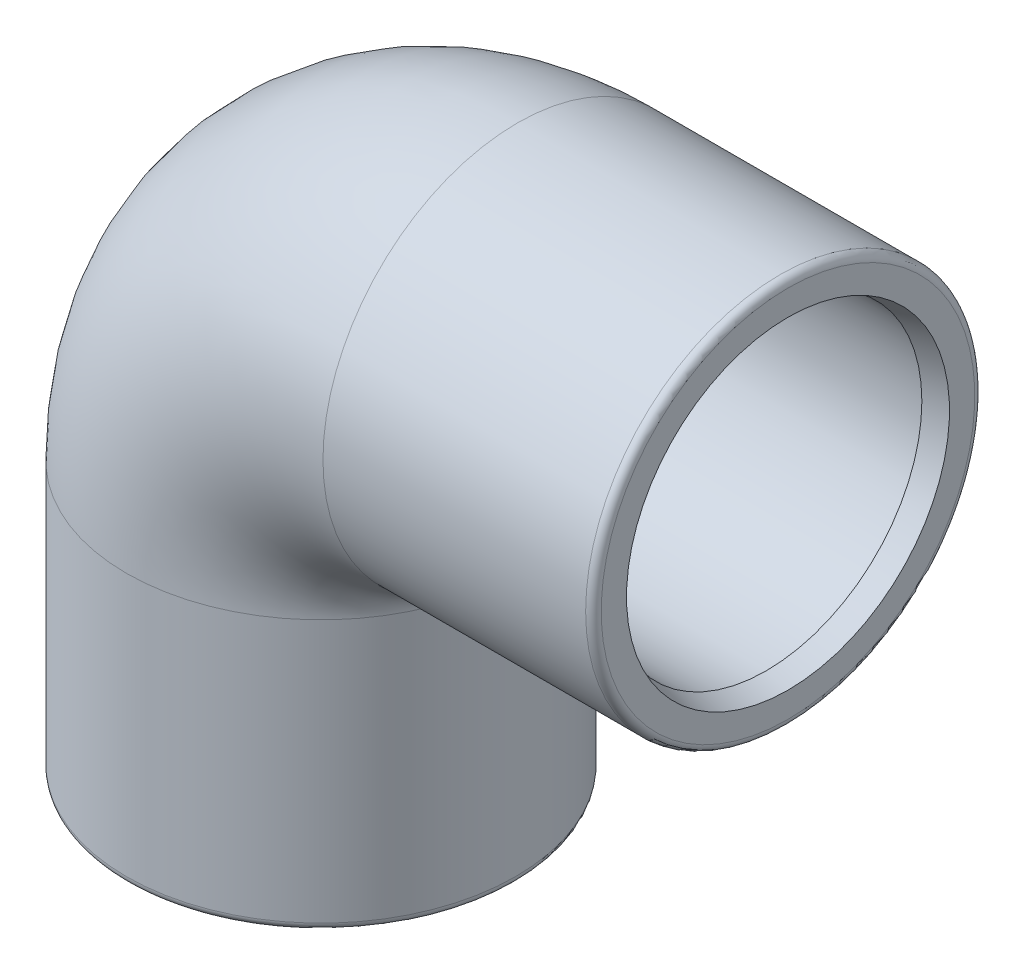
ISO-10303-21;
HEADER;
FILE_DESCRIPTION(('STEP AP214'),'2;1');
FILE_NAME('part.step','',(''),(''),'','','');
FILE_SCHEMA(('AUTOMOTIVE_DESIGN { 1 0 10303 214 1 1 1 1 }'));
ENDSEC;
DATA;
#1=APPLICATION_CONTEXT('core data for automotive mechanical design processes');
#2=APPLICATION_PROTOCOL_DEFINITION('international standard','automotive_design',2000,#1);
#3=PRODUCT_CONTEXT('',#1,'mechanical');
#4=PRODUCT('Part','Part','',(#3));
#5=PRODUCT_RELATED_PRODUCT_CATEGORY('part','',(#4));
#6=PRODUCT_DEFINITION_FORMATION('','',#4);
#7=PRODUCT_DEFINITION_CONTEXT('part definition',#1,'design');
#8=PRODUCT_DEFINITION('design','',#6,#7);
#9=PRODUCT_DEFINITION_SHAPE('','',#8);
#10=(LENGTH_UNIT() NAMED_UNIT(*) SI_UNIT(.MILLI.,.METRE.));
#11=(NAMED_UNIT(*) PLANE_ANGLE_UNIT() SI_UNIT($,.RADIAN.));
#12=(NAMED_UNIT(*) SI_UNIT($,.STERADIAN.) SOLID_ANGLE_UNIT());
#13=UNCERTAINTY_MEASURE_WITH_UNIT(LENGTH_MEASURE(1.E-05),#10,'distance_accuracy_value','');
#14=(GEOMETRIC_REPRESENTATION_CONTEXT(3) GLOBAL_UNCERTAINTY_ASSIGNED_CONTEXT((#13)) GLOBAL_UNIT_ASSIGNED_CONTEXT((#10,
#11,#12)) REPRESENTATION_CONTEXT('',''));
#15=CARTESIAN_POINT('',(0.,0.,0.));
#16=DIRECTION('',(0.,0.,1.));
#17=DIRECTION('',(1.,0.,0.));
#18=AXIS2_PLACEMENT_3D('',#15,#16,#17);
#19=CARTESIAN_POINT('',(0.,0.,0.));
#20=DIRECTION('',(0.,0.,-1.));
#21=DIRECTION('',(-1.,0.,0.));
#22=AXIS2_PLACEMENT_3D('',#19,#20,#21);
#23=TOROIDAL_SURFACE('',#22,20.2,20.);
#24=CARTESIAN_POINT('',(-20.2,0.,0.));
#25=DIRECTION('',(0.,1.,0.));
#26=DIRECTION('',(-1.,0.,0.));
#27=AXIS2_PLACEMENT_3D('',#24,#25,#26);
#28=CIRCLE('',#27,20.);
#29=CARTESIAN_POINT('',(-0.2,0.,0.));
#30=VERTEX_POINT('',#29);
#31=EDGE_CURVE('E82',#30,#30,#28,.T.);
#32=ORIENTED_EDGE('',*,*,#31,.T.);
#33=EDGE_LOOP('',(#32));
#34=FACE_BOUND('',#33,.T.);
#35=CARTESIAN_POINT('',(0.,20.2,0.));
#36=DIRECTION('',(-1.,0.,0.));
#37=DIRECTION('',(0.,1.,0.));
#38=AXIS2_PLACEMENT_3D('',#35,#36,#37);
#39=CIRCLE('',#38,20.);
#40=CARTESIAN_POINT('',(0.,0.2,0.));
#41=VERTEX_POINT('',#40);
#42=EDGE_CURVE('E11',#41,#41,#39,.T.);
#43=ORIENTED_EDGE('',*,*,#42,.T.);
#44=EDGE_LOOP('',(#43));
#45=FACE_BOUND('',#44,.T.);
#46=ADVANCED_FACE('F16',(#34,#45),#23,.T.);
#47=CARTESIAN_POINT('',(15.5,20.2,0.));
#48=DIRECTION('',(1.,0.,0.));
#49=DIRECTION('',(0.,0.,1.));
#50=AXIS2_PLACEMENT_3D('',#47,#48,#49);
#51=CYLINDRICAL_SURFACE('',#50,20.);
#52=ORIENTED_EDGE('',*,*,#42,.F.);
#53=EDGE_LOOP('',(#52));
#54=FACE_BOUND('',#53,.T.);
#55=CARTESIAN_POINT('',(27.,20.2,0.));
#56=DIRECTION('',(-1.,0.,0.));
#57=DIRECTION('',(0.,0.,1.));
#58=AXIS2_PLACEMENT_3D('',#55,#56,#57);
#59=CIRCLE('',#58,20.);
#60=CARTESIAN_POINT('',(27.,0.2,0.));
#61=VERTEX_POINT('',#60);
#62=EDGE_CURVE('E56',#61,#61,#59,.T.);
#63=ORIENTED_EDGE('',*,*,#62,.T.);
#64=EDGE_LOOP('',(#63));
#65=FACE_BOUND('',#64,.T.);
#66=ADVANCED_FACE('F101',(#54,#65),#51,.T.);
#67=CARTESIAN_POINT('',(0.,0.,0.));
#68=DIRECTION('',(0.,0.,-1.));
#69=DIRECTION('',(-1.,0.,0.));
#70=AXIS2_PLACEMENT_3D('',#67,#68,#69);
#71=TOROIDAL_SURFACE('',#70,20.2,14.4);
#72=CARTESIAN_POINT('',(-20.2,0.,0.));
#73=DIRECTION('',(0.,1.,0.));
#74=DIRECTION('',(-1.,0.,0.));
#75=AXIS2_PLACEMENT_3D('',#72,#73,#74);
#76=CIRCLE('',#75,14.4);
#77=CARTESIAN_POINT('',(-5.8,0.,0.));
#78=VERTEX_POINT('',#77);
#79=EDGE_CURVE('E19',#78,#78,#76,.T.);
#80=ORIENTED_EDGE('',*,*,#79,.F.);
#81=EDGE_LOOP('',(#80));
#82=FACE_BOUND('',#81,.T.);
#83=CARTESIAN_POINT('',(0.,20.2,0.));
#84=DIRECTION('',(-1.,0.,0.));
#85=DIRECTION('',(0.,1.,0.));
#86=AXIS2_PLACEMENT_3D('',#83,#84,#85);
#87=CIRCLE('',#86,14.4);
#88=CARTESIAN_POINT('',(0.,5.8,0.));
#89=VERTEX_POINT('',#88);
#90=EDGE_CURVE('E25',#89,#89,#87,.T.);
#91=ORIENTED_EDGE('',*,*,#90,.F.);
#92=EDGE_LOOP('',(#91));
#93=FACE_BOUND('',#92,.T.);
#94=ADVANCED_FACE('F98',(#82,#93),#71,.F.);
#95=CARTESIAN_POINT('',(15.5,20.2,0.));
#96=DIRECTION('',(1.,0.,0.));
#97=DIRECTION('',(0.,0.,1.));
#98=AXIS2_PLACEMENT_3D('',#95,#96,#97);
#99=CYLINDRICAL_SURFACE('',#98,16.);
#100=CARTESIAN_POINT('',(0.,20.2,0.));
#101=DIRECTION('',(-1.,0.,0.));
#102=DIRECTION('',(0.,0.,1.));
#103=AXIS2_PLACEMENT_3D('',#100,#101,#102);
#104=CIRCLE('',#103,16.);
#105=CARTESIAN_POINT('',(0.,20.2,16.));
#106=VERTEX_POINT('',#105);
#107=EDGE_CURVE('E87',#106,#106,#104,.T.);
#108=ORIENTED_EDGE('',*,*,#107,.T.);
#109=EDGE_LOOP('',(#108));
#110=FACE_BOUND('',#109,.T.);
#111=CARTESIAN_POINT('',(25.5607695154587,20.2,0.));
#112=DIRECTION('',(1.,0.,0.));
#113=DIRECTION('',(0.,0.,1.));
#114=AXIS2_PLACEMENT_3D('',#111,#112,#113);
#115=CIRCLE('',#114,16.);
#116=CARTESIAN_POINT('',(25.5607695154587,36.2,0.));
#117=VERTEX_POINT('',#116);
#118=EDGE_CURVE('E72',#117,#117,#115,.T.);
#119=ORIENTED_EDGE('',*,*,#118,.T.);
#120=EDGE_LOOP('',(#119));
#121=FACE_BOUND('',#120,.T.);
#122=ADVANCED_FACE('F100',(#110,#121),#99,.F.);
#123=CARTESIAN_POINT('',(0.,20.2,0.));
#124=DIRECTION('',(-1.,0.,0.));
#125=DIRECTION('',(0.,0.,1.));
#126=AXIS2_PLACEMENT_3D('',#123,#124,#125);
#127=PLANE('',#126);
#128=ORIENTED_EDGE('',*,*,#90,.T.);
#129=EDGE_LOOP('',(#128));
#130=FACE_BOUND('',#129,.T.);
#131=ORIENTED_EDGE('',*,*,#107,.F.);
#132=EDGE_LOOP('',(#131));
#133=FACE_BOUND('',#132,.T.);
#134=ADVANCED_FACE('F95',(#130,#133),#127,.F.);
#135=CARTESIAN_POINT('',(-20.2,-15.5,0.));
#136=DIRECTION('',(0.,1.,0.));
#137=DIRECTION('',(0.,0.,1.));
#138=AXIS2_PLACEMENT_3D('',#135,#136,#137);
#139=CYLINDRICAL_SURFACE('',#138,16.);
#140=CARTESIAN_POINT('',(-20.2,0.,0.));
#141=DIRECTION('',(0.,1.,0.));
#142=DIRECTION('',(0.,0.,1.));
#143=AXIS2_PLACEMENT_3D('',#140,#141,#142);
#144=CIRCLE('',#143,16.);
#145=CARTESIAN_POINT('',(-20.2,0.,16.));
#146=VERTEX_POINT('',#145);
#147=EDGE_CURVE('E85',#146,#146,#144,.T.);
#148=ORIENTED_EDGE('',*,*,#147,.T.);
#149=EDGE_LOOP('',(#148));
#150=FACE_BOUND('',#149,.T.);
#151=CARTESIAN_POINT('',(-20.2,-25.5607695154587,0.));
#152=DIRECTION('',(0.,-1.,0.));
#153=DIRECTION('',(0.,0.,1.));
#154=AXIS2_PLACEMENT_3D('',#151,#152,#153);
#155=CIRCLE('',#154,16.);
#156=CARTESIAN_POINT('',(-4.2,-25.5607695154587,0.));
#157=VERTEX_POINT('',#156);
#158=EDGE_CURVE('E61',#157,#157,#155,.T.);
#159=ORIENTED_EDGE('',*,*,#158,.T.);
#160=EDGE_LOOP('',(#159));
#161=FACE_BOUND('',#160,.T.);
#162=ADVANCED_FACE('F156',(#150,#161),#139,.F.);
#163=CARTESIAN_POINT('',(-20.2,0.,0.));
#164=DIRECTION('',(0.,1.,0.));
#165=DIRECTION('',(0.,0.,-1.));
#166=AXIS2_PLACEMENT_3D('',#163,#164,#165);
#167=PLANE('',#166);
#168=ORIENTED_EDGE('',*,*,#79,.T.);
#169=EDGE_LOOP('',(#168));
#170=FACE_BOUND('',#169,.T.);
#171=ORIENTED_EDGE('',*,*,#147,.F.);
#172=EDGE_LOOP('',(#171));
#173=FACE_BOUND('',#172,.T.);
#174=ADVANCED_FACE('F154',(#170,#173),#167,.F.);
#175=CARTESIAN_POINT('',(27.8,20.2,0.));
#176=DIRECTION('',(-1.,0.,0.));
#177=DIRECTION('',(0.,0.,1.));
#178=AXIS2_PLACEMENT_3D('',#175,#176,#177);
#179=PLANE('',#178);
#180=CARTESIAN_POINT('',(27.8,20.2,0.));
#181=DIRECTION('',(1.,0.,0.));
#182=DIRECTION('',(0.,-1.,0.));
#183=AXIS2_PLACEMENT_3D('',#180,#181,#182);
#184=CIRCLE('',#183,19.2);
#185=CARTESIAN_POINT('',(27.8,1.,0.));
#186=VERTEX_POINT('',#185);
#187=EDGE_CURVE('E77',#186,#186,#184,.T.);
#188=ORIENTED_EDGE('',*,*,#187,.T.);
#189=EDGE_LOOP('',(#188));
#190=FACE_BOUND('',#189,.T.);
#191=CARTESIAN_POINT('',(27.8,20.2,0.));
#192=DIRECTION('',(-1.,0.,0.));
#193=DIRECTION('',(0.,1.,0.));
#194=AXIS2_PLACEMENT_3D('',#191,#192,#193);
#195=CIRCLE('',#194,16.6);
#196=CARTESIAN_POINT('',(27.8,36.8,0.));
#197=VERTEX_POINT('',#196);
#198=EDGE_CURVE('E69',#197,#197,#195,.T.);
#199=ORIENTED_EDGE('',*,*,#198,.T.);
#200=EDGE_LOOP('',(#199));
#201=FACE_BOUND('',#200,.T.);
#202=ADVANCED_FACE('F70',(#190,#201),#179,.F.);
#203=CARTESIAN_POINT('',(-20.2,-27.8,0.));
#204=DIRECTION('',(0.,1.,0.));
#205=DIRECTION('',(0.,0.,1.));
#206=AXIS2_PLACEMENT_3D('',#203,#204,#205);
#207=PLANE('',#206);
#208=CARTESIAN_POINT('',(-20.2,-27.8,0.));
#209=DIRECTION('',(0.,-1.,0.));
#210=DIRECTION('',(-1.,0.,0.));
#211=AXIS2_PLACEMENT_3D('',#208,#209,#210);
#212=CIRCLE('',#211,19.2);
#213=CARTESIAN_POINT('',(-39.4,-27.8,0.));
#214=VERTEX_POINT('',#213);
#215=EDGE_CURVE('E80',#214,#214,#212,.T.);
#216=ORIENTED_EDGE('',*,*,#215,.T.);
#217=EDGE_LOOP('',(#216));
#218=FACE_BOUND('',#217,.T.);
#219=CARTESIAN_POINT('',(-20.2,-27.8,0.));
#220=DIRECTION('',(0.,1.,0.));
#221=DIRECTION('',(1.,0.,0.));
#222=AXIS2_PLACEMENT_3D('',#219,#220,#221);
#223=CIRCLE('',#222,16.6);
#224=CARTESIAN_POINT('',(-3.6,-27.8,0.));
#225=VERTEX_POINT('',#224);
#226=EDGE_CURVE('E74',#225,#225,#223,.T.);
#227=ORIENTED_EDGE('',*,*,#226,.T.);
#228=EDGE_LOOP('',(#227));
#229=FACE_BOUND('',#228,.T.);
#230=ADVANCED_FACE('F125',(#218,#229),#207,.F.);
#231=CARTESIAN_POINT('',(-20.2,-15.5,0.));
#232=DIRECTION('',(0.,1.,0.));
#233=DIRECTION('',(0.,0.,1.));
#234=AXIS2_PLACEMENT_3D('',#231,#232,#233);
#235=CYLINDRICAL_SURFACE('',#234,20.);
#236=CARTESIAN_POINT('',(-20.2,-27.,0.));
#237=DIRECTION('',(0.,-1.,0.));
#238=DIRECTION('',(0.,0.,1.));
#239=AXIS2_PLACEMENT_3D('',#236,#237,#238);
#240=CIRCLE('',#239,20.);
#241=CARTESIAN_POINT('',(-40.2,-27.,0.));
#242=VERTEX_POINT('',#241);
#243=EDGE_CURVE('E83',#242,#242,#240,.T.);
#244=ORIENTED_EDGE('',*,*,#243,.F.);
#245=EDGE_LOOP('',(#244));
#246=FACE_BOUND('',#245,.T.);
#247=ORIENTED_EDGE('',*,*,#31,.F.);
#248=EDGE_LOOP('',(#247));
#249=FACE_BOUND('',#248,.T.);
#250=ADVANCED_FACE('F122',(#246,#249),#235,.T.);
#251=CARTESIAN_POINT('',(-20.2,-27.,0.));
#252=DIRECTION('',(0.,-1.,0.));
#253=DIRECTION('',(0.,0.,1.));
#254=AXIS2_PLACEMENT_3D('',#251,#252,#253);
#255=TOROIDAL_SURFACE('',#254,19.2,0.8);
#256=ORIENTED_EDGE('',*,*,#215,.F.);
#257=EDGE_LOOP('',(#256));
#258=FACE_BOUND('',#257,.T.);
#259=ORIENTED_EDGE('',*,*,#243,.T.);
#260=EDGE_LOOP('',(#259));
#261=FACE_BOUND('',#260,.T.);
#262=ADVANCED_FACE('F124',(#258,#261),#255,.T.);
#263=CARTESIAN_POINT('',(27.,20.2,0.));
#264=DIRECTION('',(1.,0.,0.));
#265=DIRECTION('',(0.,0.,1.));
#266=AXIS2_PLACEMENT_3D('',#263,#264,#265);
#267=TOROIDAL_SURFACE('',#266,19.2,0.8);
#268=ORIENTED_EDGE('',*,*,#187,.F.);
#269=EDGE_LOOP('',(#268));
#270=FACE_BOUND('',#269,.T.);
#271=ORIENTED_EDGE('',*,*,#62,.F.);
#272=EDGE_LOOP('',(#271));
#273=FACE_BOUND('',#272,.T.);
#274=ADVANCED_FACE('F131',(#270,#273),#267,.T.);
#275=CARTESIAN_POINT('',(-20.2,-26.6803847577293,0.));
#276=DIRECTION('',(0.,-1.,0.));
#277=DIRECTION('',(1.,0.,0.));
#278=AXIS2_PLACEMENT_3D('',#275,#276,#277);
#279=CONICAL_SURFACE('',#278,16.3,0.26179938779915);
#280=ORIENTED_EDGE('',*,*,#158,.F.);
#281=EDGE_LOOP('',(#280));
#282=FACE_BOUND('',#281,.T.);
#283=ORIENTED_EDGE('',*,*,#226,.F.);
#284=EDGE_LOOP('',(#283));
#285=FACE_BOUND('',#284,.T.);
#286=ADVANCED_FACE('F138',(#282,#285),#279,.F.);
#287=CARTESIAN_POINT('',(26.6803847577293,20.2,0.));
#288=DIRECTION('',(1.,0.,0.));
#289=DIRECTION('',(0.,1.,0.));
#290=AXIS2_PLACEMENT_3D('',#287,#288,#289);
#291=CONICAL_SURFACE('',#290,16.3,0.26179938779915);
#292=ORIENTED_EDGE('',*,*,#118,.F.);
#293=EDGE_LOOP('',(#292));
#294=FACE_BOUND('',#293,.T.);
#295=ORIENTED_EDGE('',*,*,#198,.F.);
#296=EDGE_LOOP('',(#295));
#297=FACE_BOUND('',#296,.T.);
#298=ADVANCED_FACE('F140',(#294,#297),#291,.F.);
#299=CLOSED_SHELL('',(#46,#66,#94,#122,#134,#162,#174,#202,#230,#250,#262,#274,#286,#298));
#300=MANIFOLD_SOLID_BREP('B1',#299);
#301=ADVANCED_BREP_SHAPE_REPRESENTATION('',(#18,#300),#14);
#302=SHAPE_DEFINITION_REPRESENTATION(#9,#301);
ENDSEC;
END-ISO-10303-21;
